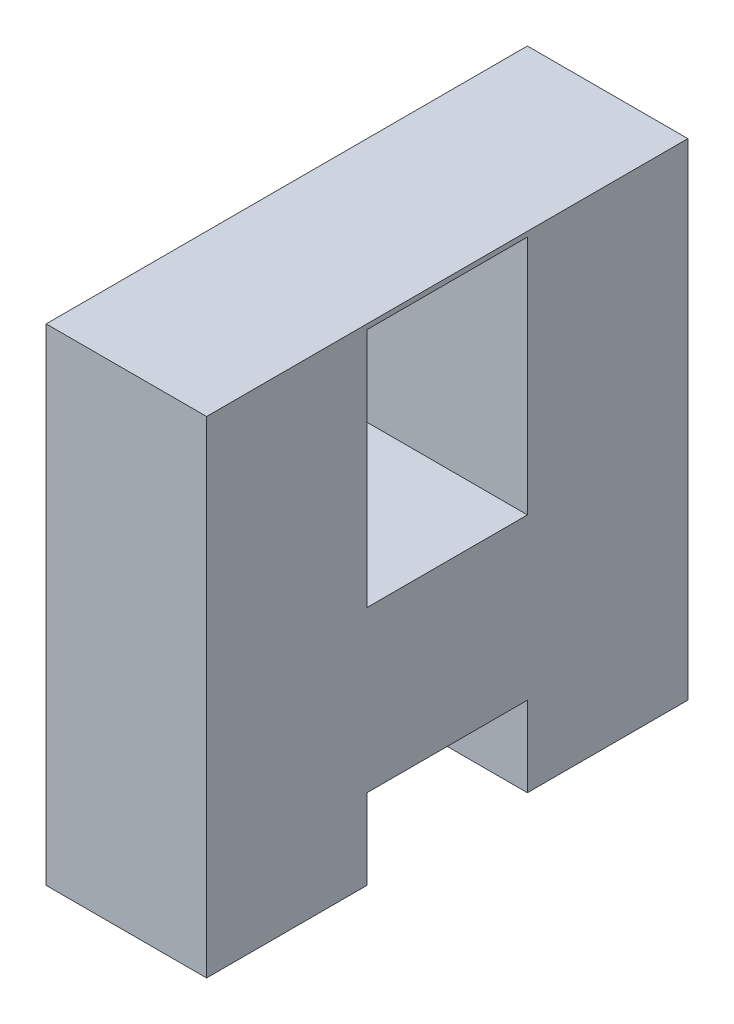
ISO-10303-21;
HEADER;
FILE_DESCRIPTION(('STEP AP214'),'2;1');
FILE_NAME('part.step','',(''),(''),'','','');
FILE_SCHEMA(('AUTOMOTIVE_DESIGN { 1 0 10303 214 1 1 1 1 }'));
ENDSEC;
DATA;
#1=APPLICATION_CONTEXT('core data for automotive mechanical design processes');
#2=APPLICATION_PROTOCOL_DEFINITION('international standard','automotive_design',2000,#1);
#3=PRODUCT_CONTEXT('',#1,'mechanical');
#4=PRODUCT('Part','Part','',(#3));
#5=PRODUCT_RELATED_PRODUCT_CATEGORY('part','',(#4));
#6=PRODUCT_DEFINITION_FORMATION('','',#4);
#7=PRODUCT_DEFINITION_CONTEXT('part definition',#1,'design');
#8=PRODUCT_DEFINITION('design','',#6,#7);
#9=PRODUCT_DEFINITION_SHAPE('','',#8);
#10=(LENGTH_UNIT() NAMED_UNIT(*) SI_UNIT(.MILLI.,.METRE.));
#11=(NAMED_UNIT(*) PLANE_ANGLE_UNIT() SI_UNIT($,.RADIAN.));
#12=(NAMED_UNIT(*) SI_UNIT($,.STERADIAN.) SOLID_ANGLE_UNIT());
#13=UNCERTAINTY_MEASURE_WITH_UNIT(LENGTH_MEASURE(1.E-05),#10,'distance_accuracy_value','');
#14=(GEOMETRIC_REPRESENTATION_CONTEXT(3) GLOBAL_UNCERTAINTY_ASSIGNED_CONTEXT((#13)) GLOBAL_UNIT_ASSIGNED_CONTEXT((#10,
#11,#12)) REPRESENTATION_CONTEXT('',''));
#15=CARTESIAN_POINT('',(0.,0.,0.));
#16=DIRECTION('',(0.,0.,1.));
#17=DIRECTION('',(1.,0.,0.));
#18=AXIS2_PLACEMENT_3D('',#15,#16,#17);
#19=CARTESIAN_POINT('',(101.6,0.,-203.2));
#20=DIRECTION('',(0.,0.,1.));
#21=DIRECTION('',(1.,0.,0.));
#22=AXIS2_PLACEMENT_3D('',#19,#20,#21);
#23=PLANE('',#22);
#24=DIRECTION('',(0.,1.,0.));
#25=VECTOR('',#24,1.);
#26=CARTESIAN_POINT('',(0.,0.,-203.2));
#27=LINE('',#26,#25);
#28=CARTESIAN_POINT('',(0.,0.,-203.2));
#29=VERTEX_POINT('',#28);
#30=CARTESIAN_POINT('',(0.,50.8,-203.2));
#31=VERTEX_POINT('',#30);
#32=EDGE_CURVE('E225',#29,#31,#27,.T.);
#33=ORIENTED_EDGE('',*,*,#32,.F.);
#34=DIRECTION('',(-1.,0.,0.));
#35=VECTOR('',#34,1.);
#36=CARTESIAN_POINT('',(101.6,0.,-203.2));
#37=LINE('',#36,#35);
#38=CARTESIAN_POINT('',(101.6,0.,-203.2));
#39=VERTEX_POINT('',#38);
#40=EDGE_CURVE('E11',#39,#29,#37,.T.);
#41=ORIENTED_EDGE('',*,*,#40,.F.);
#42=DIRECTION('',(0.,1.,0.));
#43=VECTOR('',#42,1.);
#44=CARTESIAN_POINT('',(101.6,0.,-203.2));
#45=LINE('',#44,#43);
#46=CARTESIAN_POINT('',(101.6,50.8,-203.2));
#47=VERTEX_POINT('',#46);
#48=EDGE_CURVE('E256',#39,#47,#45,.T.);
#49=ORIENTED_EDGE('',*,*,#48,.T.);
#50=DIRECTION('',(-1.,0.,0.));
#51=VECTOR('',#50,1.);
#52=CARTESIAN_POINT('',(101.6,50.8,-203.2));
#53=LINE('',#52,#51);
#54=EDGE_CURVE('E109',#47,#31,#53,.T.);
#55=ORIENTED_EDGE('',*,*,#54,.T.);
#56=EDGE_LOOP('',(#33,#41,#49,#55));
#57=FACE_BOUND('',#56,.T.);
#58=ADVANCED_FACE('F43',(#57),#23,.T.);
#59=CARTESIAN_POINT('',(101.6,0.,0.));
#60=DIRECTION('',(0.,1.,0.));
#61=DIRECTION('',(0.,0.,1.));
#62=AXIS2_PLACEMENT_3D('',#59,#60,#61);
#63=PLANE('',#62);
#64=DIRECTION('',(0.,0.,-1.));
#65=VECTOR('',#64,1.);
#66=CARTESIAN_POINT('',(0.,0.,0.));
#67=LINE('',#66,#65);
#68=CARTESIAN_POINT('',(0.,0.,-304.8));
#69=VERTEX_POINT('',#68);
#70=EDGE_CURVE('E221',#29,#69,#67,.T.);
#71=ORIENTED_EDGE('',*,*,#70,.T.);
#72=DIRECTION('',(-1.,0.,0.));
#73=VECTOR('',#72,1.);
#74=CARTESIAN_POINT('',(101.6,0.,-304.8));
#75=LINE('',#74,#73);
#76=CARTESIAN_POINT('',(101.6,0.,-304.8));
#77=VERTEX_POINT('',#76);
#78=EDGE_CURVE('E54',#77,#69,#75,.T.);
#79=ORIENTED_EDGE('',*,*,#78,.F.);
#80=DIRECTION('',(0.,0.,-1.));
#81=VECTOR('',#80,1.);
#82=CARTESIAN_POINT('',(101.6,0.,0.));
#83=LINE('',#82,#81);
#84=EDGE_CURVE('E164',#39,#77,#83,.T.);
#85=ORIENTED_EDGE('',*,*,#84,.F.);
#86=ORIENTED_EDGE('',*,*,#40,.T.);
#87=EDGE_LOOP('',(#71,#79,#85,#86));
#88=FACE_BOUND('',#87,.T.);
#89=ADVANCED_FACE('F287',(#88),#63,.F.);
#90=CARTESIAN_POINT('',(101.6,0.,-304.8));
#91=DIRECTION('',(0.,0.,1.));
#92=DIRECTION('',(1.,0.,0.));
#93=AXIS2_PLACEMENT_3D('',#90,#91,#92);
#94=PLANE('',#93);
#95=DIRECTION('',(0.,1.,0.));
#96=VECTOR('',#95,1.);
#97=CARTESIAN_POINT('',(0.,0.,-304.8));
#98=LINE('',#97,#96);
#99=CARTESIAN_POINT('',(0.,307.975,-304.8));
#100=VERTEX_POINT('',#99);
#101=EDGE_CURVE('E217',#69,#100,#98,.T.);
#102=ORIENTED_EDGE('',*,*,#101,.T.);
#103=DIRECTION('',(-1.,0.,0.));
#104=VECTOR('',#103,1.);
#105=CARTESIAN_POINT('',(101.6,307.975,-304.8));
#106=LINE('',#105,#104);
#107=CARTESIAN_POINT('',(101.6,307.975,-304.8));
#108=VERTEX_POINT('',#107);
#109=EDGE_CURVE('E180',#108,#100,#106,.T.);
#110=ORIENTED_EDGE('',*,*,#109,.F.);
#111=DIRECTION('',(0.,1.,0.));
#112=VECTOR('',#111,1.);
#113=CARTESIAN_POINT('',(101.6,0.,-304.8));
#114=LINE('',#113,#112);
#115=EDGE_CURVE('E251',#77,#108,#114,.T.);
#116=ORIENTED_EDGE('',*,*,#115,.F.);
#117=ORIENTED_EDGE('',*,*,#78,.T.);
#118=EDGE_LOOP('',(#102,#110,#116,#117));
#119=FACE_BOUND('',#118,.T.);
#120=ADVANCED_FACE('F290',(#119),#94,.F.);
#121=CARTESIAN_POINT('',(101.6,307.975,0.));
#122=DIRECTION('',(0.,1.,0.));
#123=DIRECTION('',(0.,0.,1.));
#124=AXIS2_PLACEMENT_3D('',#121,#122,#123);
#125=PLANE('',#124);
#126=DIRECTION('',(0.,0.,-1.));
#127=VECTOR('',#126,1.);
#128=CARTESIAN_POINT('',(0.,307.975,0.));
#129=LINE('',#128,#127);
#130=CARTESIAN_POINT('',(0.,307.975,0.));
#131=VERTEX_POINT('',#130);
#132=EDGE_CURVE('E213',#131,#100,#129,.T.);
#133=ORIENTED_EDGE('',*,*,#132,.F.);
#134=DIRECTION('',(-1.,0.,0.));
#135=VECTOR('',#134,1.);
#136=CARTESIAN_POINT('',(101.6,307.975,0.));
#137=LINE('',#136,#135);
#138=CARTESIAN_POINT('',(101.6,307.975,0.));
#139=VERTEX_POINT('',#138);
#140=EDGE_CURVE('E173',#139,#131,#137,.T.);
#141=ORIENTED_EDGE('',*,*,#140,.F.);
#142=DIRECTION('',(0.,0.,-1.));
#143=VECTOR('',#142,1.);
#144=CARTESIAN_POINT('',(101.6,307.975,0.));
#145=LINE('',#144,#143);
#146=EDGE_CURVE('E247',#139,#108,#145,.T.);
#147=ORIENTED_EDGE('',*,*,#146,.T.);
#148=ORIENTED_EDGE('',*,*,#109,.T.);
#149=EDGE_LOOP('',(#133,#141,#147,#148));
#150=FACE_BOUND('',#149,.T.);
#151=ADVANCED_FACE('F293',(#150),#125,.T.);
#152=CARTESIAN_POINT('',(101.6,0.,0.));
#153=DIRECTION('',(0.,0.,1.));
#154=DIRECTION('',(1.,0.,0.));
#155=AXIS2_PLACEMENT_3D('',#152,#153,#154);
#156=PLANE('',#155);
#157=DIRECTION('',(0.,1.,0.));
#158=VECTOR('',#157,1.);
#159=CARTESIAN_POINT('',(0.,0.,0.));
#160=LINE('',#159,#158);
#161=CARTESIAN_POINT('',(0.,0.,0.));
#162=VERTEX_POINT('',#161);
#163=EDGE_CURVE('E209',#162,#131,#160,.T.);
#164=ORIENTED_EDGE('',*,*,#163,.F.);
#165=DIRECTION('',(-1.,0.,0.));
#166=VECTOR('',#165,1.);
#167=CARTESIAN_POINT('',(101.6,0.,0.));
#168=LINE('',#167,#166);
#169=CARTESIAN_POINT('',(101.6,0.,0.));
#170=VERTEX_POINT('',#169);
#171=EDGE_CURVE('E169',#170,#162,#168,.T.);
#172=ORIENTED_EDGE('',*,*,#171,.F.);
#173=DIRECTION('',(0.,1.,0.));
#174=VECTOR('',#173,1.);
#175=CARTESIAN_POINT('',(101.6,0.,0.));
#176=LINE('',#175,#174);
#177=EDGE_CURVE('E160',#170,#139,#176,.T.);
#178=ORIENTED_EDGE('',*,*,#177,.T.);
#179=ORIENTED_EDGE('',*,*,#140,.T.);
#180=EDGE_LOOP('',(#164,#172,#178,#179));
#181=FACE_BOUND('',#180,.T.);
#182=ADVANCED_FACE('F296',(#181),#156,.T.);
#183=CARTESIAN_POINT('',(0.,0.,-101.6));
#184=VERTEX_POINT('',#183);
#185=EDGE_CURVE('E167',#162,#184,#67,.T.);
#186=ORIENTED_EDGE('',*,*,#185,.T.);
#187=DIRECTION('',(-1.,0.,0.));
#188=VECTOR('',#187,1.);
#189=CARTESIAN_POINT('',(101.6,0.,-101.6));
#190=LINE('',#189,#188);
#191=CARTESIAN_POINT('',(101.6,0.,-101.6));
#192=VERTEX_POINT('',#191);
#193=EDGE_CURVE('E149',#192,#184,#190,.T.);
#194=ORIENTED_EDGE('',*,*,#193,.F.);
#195=EDGE_CURVE('E153',#170,#192,#83,.T.);
#196=ORIENTED_EDGE('',*,*,#195,.F.);
#197=ORIENTED_EDGE('',*,*,#171,.T.);
#198=EDGE_LOOP('',(#186,#194,#196,#197));
#199=FACE_BOUND('',#198,.T.);
#200=ADVANCED_FACE('F165',(#199),#63,.F.);
#201=CARTESIAN_POINT('',(101.6,0.,-101.6));
#202=DIRECTION('',(0.,0.,1.));
#203=DIRECTION('',(0.,-1.,0.));
#204=AXIS2_PLACEMENT_3D('',#201,#202,#203);
#205=PLANE('',#204);
#206=DIRECTION('',(0.,1.,0.));
#207=VECTOR('',#206,1.);
#208=CARTESIAN_POINT('',(0.,0.,-101.6));
#209=LINE('',#208,#207);
#210=CARTESIAN_POINT('',(0.,50.8,-101.6));
#211=VERTEX_POINT('',#210);
#212=EDGE_CURVE('E206',#184,#211,#209,.T.);
#213=ORIENTED_EDGE('',*,*,#212,.T.);
#214=DIRECTION('',(-1.,0.,0.));
#215=VECTOR('',#214,1.);
#216=CARTESIAN_POINT('',(101.6,50.8,-101.6));
#217=LINE('',#216,#215);
#218=CARTESIAN_POINT('',(101.6,50.8,-101.6));
#219=VERTEX_POINT('',#218);
#220=EDGE_CURVE('E151',#219,#211,#217,.T.);
#221=ORIENTED_EDGE('',*,*,#220,.F.);
#222=DIRECTION('',(0.,1.,0.));
#223=VECTOR('',#222,1.);
#224=CARTESIAN_POINT('',(101.6,0.,-101.6));
#225=LINE('',#224,#223);
#226=EDGE_CURVE('E144',#192,#219,#225,.T.);
#227=ORIENTED_EDGE('',*,*,#226,.F.);
#228=ORIENTED_EDGE('',*,*,#193,.T.);
#229=EDGE_LOOP('',(#213,#221,#227,#228));
#230=FACE_BOUND('',#229,.T.);
#231=ADVANCED_FACE('F147',(#230),#205,.F.);
#232=CARTESIAN_POINT('',(101.6,0.,-203.2));
#233=DIRECTION('',(0.,0.,1.));
#234=DIRECTION('',(1.,0.,0.));
#235=AXIS2_PLACEMENT_3D('',#232,#233,#234);
#236=PLANE('',#235);
#237=DIRECTION('',(0.,1.,0.));
#238=VECTOR('',#237,1.);
#239=CARTESIAN_POINT('',(0.,0.,-203.2));
#240=LINE('',#239,#238);
#241=CARTESIAN_POINT('',(0.,152.4,-203.2));
#242=VERTEX_POINT('',#241);
#243=CARTESIAN_POINT('',(0.,304.8,-203.2));
#244=VERTEX_POINT('',#243);
#245=EDGE_CURVE('E239',#242,#244,#240,.T.);
#246=ORIENTED_EDGE('',*,*,#245,.F.);
#247=DIRECTION('',(-1.,0.,0.));
#248=VECTOR('',#247,1.);
#249=CARTESIAN_POINT('',(101.6,152.4,-203.2));
#250=LINE('',#249,#248);
#251=CARTESIAN_POINT('',(101.6,152.4,-203.2));
#252=VERTEX_POINT('',#251);
#253=EDGE_CURVE('E47',#252,#242,#250,.T.);
#254=ORIENTED_EDGE('',*,*,#253,.F.);
#255=DIRECTION('',(0.,1.,0.));
#256=VECTOR('',#255,1.);
#257=CARTESIAN_POINT('',(101.6,0.,-203.2));
#258=LINE('',#257,#256);
#259=CARTESIAN_POINT('',(101.6,304.8,-203.2));
#260=VERTEX_POINT('',#259);
#261=EDGE_CURVE('E205',#252,#260,#258,.T.);
#262=ORIENTED_EDGE('',*,*,#261,.T.);
#263=DIRECTION('',(-1.,0.,0.));
#264=VECTOR('',#263,1.);
#265=CARTESIAN_POINT('',(101.6,304.8,-203.2));
#266=LINE('',#265,#264);
#267=EDGE_CURVE('E186',#260,#244,#266,.T.);
#268=ORIENTED_EDGE('',*,*,#267,.T.);
#269=EDGE_LOOP('',(#246,#254,#262,#268));
#270=FACE_BOUND('',#269,.T.);
#271=ADVANCED_FACE('F45',(#270),#236,.T.);
#272=CARTESIAN_POINT('',(101.6,152.4,0.));
#273=DIRECTION('',(0.,1.,0.));
#274=DIRECTION('',(0.,0.,1.));
#275=AXIS2_PLACEMENT_3D('',#272,#273,#274);
#276=PLANE('',#275);
#277=DIRECTION('',(0.,0.,-1.));
#278=VECTOR('',#277,1.);
#279=CARTESIAN_POINT('',(0.,152.4,0.));
#280=LINE('',#279,#278);
#281=CARTESIAN_POINT('',(0.,152.4,-101.6));
#282=VERTEX_POINT('',#281);
#283=EDGE_CURVE('E235',#282,#242,#280,.T.);
#284=ORIENTED_EDGE('',*,*,#283,.F.);
#285=DIRECTION('',(-1.,0.,0.));
#286=VECTOR('',#285,1.);
#287=CARTESIAN_POINT('',(101.6,152.4,-101.6));
#288=LINE('',#287,#286);
#289=CARTESIAN_POINT('',(101.6,152.4,-101.6));
#290=VERTEX_POINT('',#289);
#291=EDGE_CURVE('E192',#290,#282,#288,.T.);
#292=ORIENTED_EDGE('',*,*,#291,.F.);
#293=DIRECTION('',(0.,0.,-1.));
#294=VECTOR('',#293,1.);
#295=CARTESIAN_POINT('',(101.6,152.4,0.));
#296=LINE('',#295,#294);
#297=EDGE_CURVE('E265',#290,#252,#296,.T.);
#298=ORIENTED_EDGE('',*,*,#297,.T.);
#299=ORIENTED_EDGE('',*,*,#253,.T.);
#300=EDGE_LOOP('',(#284,#292,#298,#299));
#301=FACE_BOUND('',#300,.T.);
#302=ADVANCED_FACE('F273',(#301),#276,.T.);
#303=CARTESIAN_POINT('',(101.6,0.,-101.6));
#304=DIRECTION('',(0.,0.,1.));
#305=DIRECTION('',(1.,0.,0.));
#306=AXIS2_PLACEMENT_3D('',#303,#304,#305);
#307=PLANE('',#306);
#308=DIRECTION('',(0.,1.,0.));
#309=VECTOR('',#308,1.);
#310=CARTESIAN_POINT('',(0.,0.,-101.6));
#311=LINE('',#310,#309);
#312=CARTESIAN_POINT('',(0.,304.8,-101.6));
#313=VERTEX_POINT('',#312);
#314=EDGE_CURVE('E232',#282,#313,#311,.T.);
#315=ORIENTED_EDGE('',*,*,#314,.T.);
#316=DIRECTION('',(-1.,0.,0.));
#317=VECTOR('',#316,1.);
#318=CARTESIAN_POINT('',(101.6,304.8,-101.6));
#319=LINE('',#318,#317);
#320=CARTESIAN_POINT('',(101.6,304.8,-101.6));
#321=VERTEX_POINT('',#320);
#322=EDGE_CURVE('E189',#321,#313,#319,.T.);
#323=ORIENTED_EDGE('',*,*,#322,.F.);
#324=DIRECTION('',(0.,1.,0.));
#325=VECTOR('',#324,1.);
#326=CARTESIAN_POINT('',(101.6,0.,-101.6));
#327=LINE('',#326,#325);
#328=EDGE_CURVE('E262',#290,#321,#327,.T.);
#329=ORIENTED_EDGE('',*,*,#328,.F.);
#330=ORIENTED_EDGE('',*,*,#291,.T.);
#331=EDGE_LOOP('',(#315,#323,#329,#330));
#332=FACE_BOUND('',#331,.T.);
#333=ADVANCED_FACE('F275',(#332),#307,.F.);
#334=CARTESIAN_POINT('',(101.6,304.8,0.));
#335=DIRECTION('',(0.,1.,0.));
#336=DIRECTION('',(0.,0.,1.));
#337=AXIS2_PLACEMENT_3D('',#334,#335,#336);
#338=PLANE('',#337);
#339=DIRECTION('',(0.,0.,-1.));
#340=VECTOR('',#339,1.);
#341=CARTESIAN_POINT('',(0.,304.8,0.));
#342=LINE('',#341,#340);
#343=EDGE_CURVE('E228',#313,#244,#342,.T.);
#344=ORIENTED_EDGE('',*,*,#343,.T.);
#345=ORIENTED_EDGE('',*,*,#267,.F.);
#346=DIRECTION('',(0.,0.,-1.));
#347=VECTOR('',#346,1.);
#348=CARTESIAN_POINT('',(101.6,304.8,0.));
#349=LINE('',#348,#347);
#350=EDGE_CURVE('E259',#321,#260,#349,.T.);
#351=ORIENTED_EDGE('',*,*,#350,.F.);
#352=ORIENTED_EDGE('',*,*,#322,.T.);
#353=EDGE_LOOP('',(#344,#345,#351,#352));
#354=FACE_BOUND('',#353,.T.);
#355=ADVANCED_FACE('F278',(#354),#338,.F.);
#356=CARTESIAN_POINT('',(101.6,50.8,0.));
#357=DIRECTION('',(0.,1.,0.));
#358=DIRECTION('',(0.,0.,1.));
#359=AXIS2_PLACEMENT_3D('',#356,#357,#358);
#360=PLANE('',#359);
#361=DIRECTION('',(0.,0.,-1.));
#362=VECTOR('',#361,1.);
#363=CARTESIAN_POINT('',(0.,50.8,0.));
#364=LINE('',#363,#362);
#365=EDGE_CURVE('E102',#211,#31,#364,.T.);
#366=ORIENTED_EDGE('',*,*,#365,.T.);
#367=ORIENTED_EDGE('',*,*,#54,.F.);
#368=DIRECTION('',(0.,0.,-1.));
#369=VECTOR('',#368,1.);
#370=CARTESIAN_POINT('',(101.6,50.8,0.));
#371=LINE('',#370,#369);
#372=EDGE_CURVE('E63',#219,#47,#371,.T.);
#373=ORIENTED_EDGE('',*,*,#372,.F.);
#374=ORIENTED_EDGE('',*,*,#220,.T.);
#375=EDGE_LOOP('',(#366,#367,#373,#374));
#376=FACE_BOUND('',#375,.T.);
#377=ADVANCED_FACE('F315',(#376),#360,.F.);
#378=CARTESIAN_POINT('',(101.6,0.,0.));
#379=DIRECTION('',(1.,0.,0.));
#380=DIRECTION('',(0.,0.,-1.));
#381=AXIS2_PLACEMENT_3D('',#378,#379,#380);
#382=PLANE('',#381);
#383=ORIENTED_EDGE('',*,*,#261,.F.);
#384=ORIENTED_EDGE('',*,*,#297,.F.);
#385=ORIENTED_EDGE('',*,*,#328,.T.);
#386=ORIENTED_EDGE('',*,*,#350,.T.);
#387=EDGE_LOOP('',(#383,#384,#385,#386));
#388=FACE_BOUND('',#387,.T.);
#389=ORIENTED_EDGE('',*,*,#48,.F.);
#390=ORIENTED_EDGE('',*,*,#84,.T.);
#391=ORIENTED_EDGE('',*,*,#115,.T.);
#392=ORIENTED_EDGE('',*,*,#146,.F.);
#393=ORIENTED_EDGE('',*,*,#177,.F.);
#394=ORIENTED_EDGE('',*,*,#195,.T.);
#395=ORIENTED_EDGE('',*,*,#226,.T.);
#396=ORIENTED_EDGE('',*,*,#372,.T.);
#397=EDGE_LOOP('',(#389,#390,#391,#392,#393,#394,#395,#396));
#398=FACE_BOUND('',#397,.T.);
#399=ADVANCED_FACE('F157',(#388,#398),#382,.T.);
#400=CARTESIAN_POINT('',(0.,0.,0.));
#401=DIRECTION('',(1.,0.,0.));
#402=DIRECTION('',(0.,0.,-1.));
#403=AXIS2_PLACEMENT_3D('',#400,#401,#402);
#404=PLANE('',#403);
#405=ORIENTED_EDGE('',*,*,#245,.T.);
#406=ORIENTED_EDGE('',*,*,#343,.F.);
#407=ORIENTED_EDGE('',*,*,#314,.F.);
#408=ORIENTED_EDGE('',*,*,#283,.T.);
#409=EDGE_LOOP('',(#405,#406,#407,#408));
#410=FACE_BOUND('',#409,.T.);
#411=ORIENTED_EDGE('',*,*,#32,.T.);
#412=ORIENTED_EDGE('',*,*,#365,.F.);
#413=ORIENTED_EDGE('',*,*,#212,.F.);
#414=ORIENTED_EDGE('',*,*,#185,.F.);
#415=ORIENTED_EDGE('',*,*,#163,.T.);
#416=ORIENTED_EDGE('',*,*,#132,.T.);
#417=ORIENTED_EDGE('',*,*,#101,.F.);
#418=ORIENTED_EDGE('',*,*,#70,.F.);
#419=EDGE_LOOP('',(#411,#412,#413,#414,#415,#416,#417,#418));
#420=FACE_BOUND('',#419,.T.);
#421=ADVANCED_FACE('F280',(#410,#420),#404,.F.);
#422=CLOSED_SHELL('',(#58,#89,#120,#151,#182,#200,#231,#271,#302,#333,#355,#377,#399,#421));
#423=MANIFOLD_SOLID_BREP('B2',#422);
#424=ADVANCED_BREP_SHAPE_REPRESENTATION('',(#18,#423),#14);
#425=SHAPE_DEFINITION_REPRESENTATION(#9,#424);
ENDSEC;
END-ISO-10303-21;
